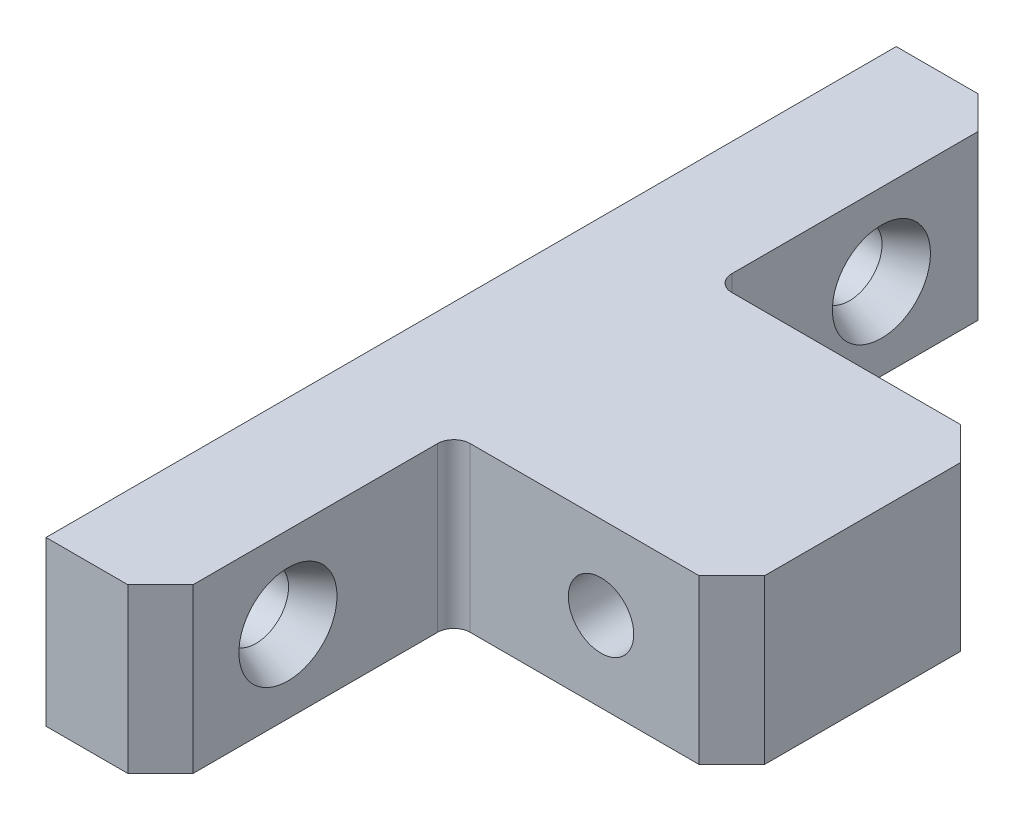
ISO-10303-21;
HEADER;
FILE_DESCRIPTION(('STEP AP214'),'2;1');
FILE_NAME('part.step','',(''),(''),'','','');
FILE_SCHEMA(('AUTOMOTIVE_DESIGN { 1 0 10303 214 1 1 1 1 }'));
ENDSEC;
DATA;
#1=APPLICATION_CONTEXT('core data for automotive mechanical design processes');
#2=APPLICATION_PROTOCOL_DEFINITION('international standard','automotive_design',2000,#1);
#3=PRODUCT_CONTEXT('',#1,'mechanical');
#4=PRODUCT('Part','Part','',(#3));
#5=PRODUCT_RELATED_PRODUCT_CATEGORY('part','',(#4));
#6=PRODUCT_DEFINITION_FORMATION('','',#4);
#7=PRODUCT_DEFINITION_CONTEXT('part definition',#1,'design');
#8=PRODUCT_DEFINITION('design','',#6,#7);
#9=PRODUCT_DEFINITION_SHAPE('','',#8);
#10=(LENGTH_UNIT() NAMED_UNIT(*) SI_UNIT(.MILLI.,.METRE.));
#11=(NAMED_UNIT(*) PLANE_ANGLE_UNIT() SI_UNIT($,.RADIAN.));
#12=(NAMED_UNIT(*) SI_UNIT($,.STERADIAN.) SOLID_ANGLE_UNIT());
#13=UNCERTAINTY_MEASURE_WITH_UNIT(LENGTH_MEASURE(1.E-05),#10,'distance_accuracy_value','');
#14=(GEOMETRIC_REPRESENTATION_CONTEXT(3) GLOBAL_UNCERTAINTY_ASSIGNED_CONTEXT((#13)) GLOBAL_UNIT_ASSIGNED_CONTEXT((#10,
#11,#12)) REPRESENTATION_CONTEXT('',''));
#15=CARTESIAN_POINT('',(0.,0.,0.));
#16=DIRECTION('',(0.,0.,1.));
#17=DIRECTION('',(1.,0.,0.));
#18=AXIS2_PLACEMENT_3D('',#15,#16,#17);
#19=CARTESIAN_POINT('',(24.,5.10377483143912,26.));
#20=DIRECTION('',(0.,0.,-1.));
#21=DIRECTION('',(-1.,0.,0.));
#22=AXIS2_PLACEMENT_3D('',#19,#20,#21);
#23=PLANE('',#22);
#24=DIRECTION('',(-1.,0.,0.));
#25=VECTOR('',#24,1.);
#26=CARTESIAN_POINT('',(24.,-4.89622516856088,26.));
#27=LINE('',#26,#25);
#28=CARTESIAN_POINT('',(4.99999999999999,-4.89622516856088,26.));
#29=VERTEX_POINT('',#28);
#30=CARTESIAN_POINT('',(0.,-4.89622516856088,26.));
#31=VERTEX_POINT('',#30);
#32=EDGE_CURVE('E134',#29,#31,#27,.T.);
#33=ORIENTED_EDGE('',*,*,#32,.F.);
#34=DIRECTION('',(0.,1.,0.));
#35=VECTOR('',#34,1.);
#36=CARTESIAN_POINT('',(5.,5.10377483143912,26.));
#37=LINE('',#36,#35);
#38=CARTESIAN_POINT('',(4.99999999999999,5.10377483143912,26.));
#39=VERTEX_POINT('',#38);
#40=EDGE_CURVE('E40',#29,#39,#37,.T.);
#41=ORIENTED_EDGE('',*,*,#40,.T.);
#42=DIRECTION('',(-1.,0.,0.));
#43=VECTOR('',#42,1.);
#44=CARTESIAN_POINT('',(24.,5.10377483143912,26.));
#45=LINE('',#44,#43);
#46=CARTESIAN_POINT('',(0.,5.10377483143912,26.));
#47=VERTEX_POINT('',#46);
#48=EDGE_CURVE('E159',#39,#47,#45,.T.);
#49=ORIENTED_EDGE('',*,*,#48,.T.);
#50=DIRECTION('',(0.,-1.,0.));
#51=VECTOR('',#50,1.);
#52=CARTESIAN_POINT('',(0.,5.10377483143912,26.));
#53=LINE('',#52,#51);
#54=EDGE_CURVE('E155',#47,#31,#53,.T.);
#55=ORIENTED_EDGE('',*,*,#54,.T.);
#56=EDGE_LOOP('',(#33,#41,#49,#55));
#57=FACE_BOUND('',#56,.T.);
#58=ADVANCED_FACE('F31',(#57),#23,.F.);
#59=CARTESIAN_POINT('',(24.,-4.89622516856088,26.));
#60=DIRECTION('',(0.,1.,0.));
#61=DIRECTION('',(0.,0.,1.));
#62=AXIS2_PLACEMENT_3D('',#59,#60,#61);
#63=PLANE('',#62);
#64=DIRECTION('',(1.,0.,0.));
#65=VECTOR('',#64,1.);
#66=CARTESIAN_POINT('',(24.,-4.89622516856088,-7.944854776541));
#67=LINE('',#66,#65);
#68=CARTESIAN_POINT('',(8.,-4.89622516856088,-7.944854776541));
#69=VERTEX_POINT('',#68);
#70=CARTESIAN_POINT('',(22.,-4.89622516856088,-7.944854776541));
#71=VERTEX_POINT('',#70);
#72=EDGE_CURVE('E256',#69,#71,#67,.T.);
#73=ORIENTED_EDGE('',*,*,#72,.T.);
#74=DIRECTION('',(0.707106781186546,0.,0.707106781186549));
#75=VECTOR('',#74,1.);
#76=CARTESIAN_POINT('',(22.,-4.89622516856088,-7.944854776541));
#77=LINE('',#76,#75);
#78=CARTESIAN_POINT('',(24.,-4.89622516856088,-5.94485477654098));
#79=VERTEX_POINT('',#78);
#80=EDGE_CURVE('E209',#71,#79,#77,.T.);
#81=ORIENTED_EDGE('',*,*,#80,.T.);
#82=DIRECTION('',(0.,0.,-1.));
#83=VECTOR('',#82,1.);
#84=CARTESIAN_POINT('',(24.,-4.89622516856088,26.));
#85=LINE('',#84,#83);
#86=CARTESIAN_POINT('',(24.,-4.89622516856088,6.055145223459));
#87=VERTEX_POINT('',#86);
#88=EDGE_CURVE('E172',#87,#79,#85,.T.);
#89=ORIENTED_EDGE('',*,*,#88,.F.);
#90=DIRECTION('',(-0.707106781186547,0.,0.707106781186549));
#91=VECTOR('',#90,1.);
#92=CARTESIAN_POINT('',(22.,-4.89622516856088,8.055145223459));
#93=LINE('',#92,#91);
#94=CARTESIAN_POINT('',(22.,-4.89622516856088,8.055145223459));
#95=VERTEX_POINT('',#94);
#96=EDGE_CURVE('E207',#87,#95,#93,.T.);
#97=ORIENTED_EDGE('',*,*,#96,.T.);
#98=DIRECTION('',(-1.,0.,0.));
#99=VECTOR('',#98,1.);
#100=CARTESIAN_POINT('',(24.,-4.89622516856088,8.055145223459));
#101=LINE('',#100,#99);
#102=CARTESIAN_POINT('',(8.,-4.89622516856088,8.055145223459));
#103=VERTEX_POINT('',#102);
#104=EDGE_CURVE('E163',#95,#103,#101,.T.);
#105=ORIENTED_EDGE('',*,*,#104,.T.);
#106=CARTESIAN_POINT('',(8.,-4.89622516856088,9.055145223459));
#107=DIRECTION('',(0.,1.,0.));
#108=DIRECTION('',(0.,0.,1.));
#109=AXIS2_PLACEMENT_3D('',#106,#107,#108);
#110=CIRCLE('',#109,1.);
#111=CARTESIAN_POINT('',(7.,-4.89622516856088,9.055145223459));
#112=VERTEX_POINT('',#111);
#113=EDGE_CURVE('E199',#103,#112,#110,.T.);
#114=ORIENTED_EDGE('',*,*,#113,.T.);
#115=DIRECTION('',(0.,0.,1.));
#116=VECTOR('',#115,1.);
#117=CARTESIAN_POINT('',(7.,-4.89622516856088,26.));
#118=LINE('',#117,#116);
#119=CARTESIAN_POINT('',(7.,-4.89622516856088,24.));
#120=VERTEX_POINT('',#119);
#121=EDGE_CURVE('E161',#112,#120,#118,.T.);
#122=ORIENTED_EDGE('',*,*,#121,.T.);
#123=DIRECTION('',(0.707106781186548,0.,-0.707106781186547));
#124=VECTOR('',#123,1.);
#125=CARTESIAN_POINT('',(5.,-4.89622516856088,26.));
#126=LINE('',#125,#124);
#127=EDGE_CURVE('E143',#120,#29,#126,.F.);
#128=ORIENTED_EDGE('',*,*,#127,.T.);
#129=ORIENTED_EDGE('',*,*,#32,.T.);
#130=DIRECTION('',(0.,0.,-1.));
#131=VECTOR('',#130,1.);
#132=CARTESIAN_POINT('',(0.,-4.89622516856088,26.));
#133=LINE('',#132,#131);
#134=CARTESIAN_POINT('',(0.,-4.89622516856088,-26.));
#135=VERTEX_POINT('',#134);
#136=EDGE_CURVE('E139',#31,#135,#133,.T.);
#137=ORIENTED_EDGE('',*,*,#136,.T.);
#138=DIRECTION('',(-1.,0.,0.));
#139=VECTOR('',#138,1.);
#140=CARTESIAN_POINT('',(24.,-4.89622516856088,-26.));
#141=LINE('',#140,#139);
#142=CARTESIAN_POINT('',(5.,-4.89622516856088,-26.));
#143=VERTEX_POINT('',#142);
#144=EDGE_CURVE('E149',#143,#135,#141,.T.);
#145=ORIENTED_EDGE('',*,*,#144,.F.);
#146=DIRECTION('',(-0.707106781186548,0.,-0.707106781186548));
#147=VECTOR('',#146,1.);
#148=CARTESIAN_POINT('',(5.,-4.89622516856088,-26.));
#149=LINE('',#148,#147);
#150=CARTESIAN_POINT('',(7.,-4.89622516856088,-24.));
#151=VERTEX_POINT('',#150);
#152=EDGE_CURVE('E205',#143,#151,#149,.F.);
#153=ORIENTED_EDGE('',*,*,#152,.T.);
#154=DIRECTION('',(0.,0.,1.));
#155=VECTOR('',#154,1.);
#156=CARTESIAN_POINT('',(7.,-4.89622516856088,26.));
#157=LINE('',#156,#155);
#158=CARTESIAN_POINT('',(7.,-4.89622516856088,-8.944854776541));
#159=VERTEX_POINT('',#158);
#160=EDGE_CURVE('E258',#151,#159,#157,.T.);
#161=ORIENTED_EDGE('',*,*,#160,.T.);
#162=CARTESIAN_POINT('',(8.,-4.89622516856088,-8.944854776541));
#163=DIRECTION('',(0.,1.,0.));
#164=DIRECTION('',(0.,0.,1.));
#165=AXIS2_PLACEMENT_3D('',#162,#163,#164);
#166=CIRCLE('',#165,1.);
#167=EDGE_CURVE('E193',#159,#69,#166,.T.);
#168=ORIENTED_EDGE('',*,*,#167,.T.);
#169=EDGE_LOOP('',(#73,#81,#89,#97,#105,#114,#122,#128,#129,#137,#145,#153,#161,#168));
#170=FACE_BOUND('',#169,.T.);
#171=ADVANCED_FACE('F137',(#170),#63,.F.);
#172=CARTESIAN_POINT('',(24.,5.10377483143912,-26.));
#173=DIRECTION('',(0.,0.,1.));
#174=DIRECTION('',(1.,0.,0.));
#175=AXIS2_PLACEMENT_3D('',#172,#173,#174);
#176=PLANE('',#175);
#177=DIRECTION('',(-1.,0.,0.));
#178=VECTOR('',#177,1.);
#179=CARTESIAN_POINT('',(24.,5.10377483143912,-26.));
#180=LINE('',#179,#178);
#181=CARTESIAN_POINT('',(5.,5.10377483143912,-26.));
#182=VERTEX_POINT('',#181);
#183=CARTESIAN_POINT('',(0.,5.10377483143912,-26.));
#184=VERTEX_POINT('',#183);
#185=EDGE_CURVE('E174',#182,#184,#180,.T.);
#186=ORIENTED_EDGE('',*,*,#185,.F.);
#187=DIRECTION('',(0.,-1.,0.));
#188=VECTOR('',#187,1.);
#189=CARTESIAN_POINT('',(5.,5.10377483143912,-26.));
#190=LINE('',#189,#188);
#191=EDGE_CURVE('E223',#182,#143,#190,.T.);
#192=ORIENTED_EDGE('',*,*,#191,.T.);
#193=ORIENTED_EDGE('',*,*,#144,.T.);
#194=DIRECTION('',(0.,1.,0.));
#195=VECTOR('',#194,1.);
#196=CARTESIAN_POINT('',(0.,5.10377483143912,-26.));
#197=LINE('',#196,#195);
#198=EDGE_CURVE('E157',#135,#184,#197,.T.);
#199=ORIENTED_EDGE('',*,*,#198,.T.);
#200=EDGE_LOOP('',(#186,#192,#193,#199));
#201=FACE_BOUND('',#200,.T.);
#202=ADVANCED_FACE('F293',(#201),#176,.F.);
#203=CARTESIAN_POINT('',(24.,5.10377483143912,26.));
#204=DIRECTION('',(0.,-1.,0.));
#205=DIRECTION('',(0.,0.,-1.));
#206=AXIS2_PLACEMENT_3D('',#203,#204,#205);
#207=PLANE('',#206);
#208=DIRECTION('',(0.,0.,1.));
#209=VECTOR('',#208,1.);
#210=CARTESIAN_POINT('',(24.,5.10377483143912,26.));
#211=LINE('',#210,#209);
#212=CARTESIAN_POINT('',(24.,5.10377483143912,-5.94485477654099));
#213=VERTEX_POINT('',#212);
#214=CARTESIAN_POINT('',(24.,5.10377483143912,6.05514522345901));
#215=VERTEX_POINT('',#214);
#216=EDGE_CURVE('E166',#213,#215,#211,.T.);
#217=ORIENTED_EDGE('',*,*,#216,.F.);
#218=DIRECTION('',(-0.707106781186546,0.,-0.707106781186549));
#219=VECTOR('',#218,1.);
#220=CARTESIAN_POINT('',(22.,5.10377483143912,-7.944854776541));
#221=LINE('',#220,#219);
#222=CARTESIAN_POINT('',(22.,5.10377483143912,-7.944854776541));
#223=VERTEX_POINT('',#222);
#224=EDGE_CURVE('E219',#213,#223,#221,.T.);
#225=ORIENTED_EDGE('',*,*,#224,.T.);
#226=DIRECTION('',(-1.,0.,0.));
#227=VECTOR('',#226,1.);
#228=CARTESIAN_POINT('',(24.,5.10377483143912,-7.944854776541));
#229=LINE('',#228,#227);
#230=CARTESIAN_POINT('',(8.,5.10377483143912,-7.944854776541));
#231=VERTEX_POINT('',#230);
#232=EDGE_CURVE('E254',#223,#231,#229,.T.);
#233=ORIENTED_EDGE('',*,*,#232,.T.);
#234=CARTESIAN_POINT('',(8.,5.10377483143912,-8.944854776541));
#235=DIRECTION('',(0.,-1.,0.));
#236=DIRECTION('',(0.,0.,-1.));
#237=AXIS2_PLACEMENT_3D('',#234,#235,#236);
#238=CIRCLE('',#237,1.);
#239=CARTESIAN_POINT('',(7.,5.10377483143912,-8.944854776541));
#240=VERTEX_POINT('',#239);
#241=EDGE_CURVE('E195',#231,#240,#238,.T.);
#242=ORIENTED_EDGE('',*,*,#241,.T.);
#243=DIRECTION('',(0.,0.,-1.));
#244=VECTOR('',#243,1.);
#245=CARTESIAN_POINT('',(7.,5.10377483143912,26.));
#246=LINE('',#245,#244);
#247=CARTESIAN_POINT('',(7.,5.10377483143912,-24.));
#248=VERTEX_POINT('',#247);
#249=EDGE_CURVE('E178',#240,#248,#246,.T.);
#250=ORIENTED_EDGE('',*,*,#249,.T.);
#251=DIRECTION('',(0.707106781186548,0.,0.707106781186548));
#252=VECTOR('',#251,1.);
#253=CARTESIAN_POINT('',(5.,5.10377483143912,-26.));
#254=LINE('',#253,#252);
#255=EDGE_CURVE('E216',#248,#182,#254,.F.);
#256=ORIENTED_EDGE('',*,*,#255,.T.);
#257=ORIENTED_EDGE('',*,*,#185,.T.);
#258=DIRECTION('',(0.,0.,1.));
#259=VECTOR('',#258,1.);
#260=CARTESIAN_POINT('',(0.,5.10377483143912,26.));
#261=LINE('',#260,#259);
#262=EDGE_CURVE('E170',#184,#47,#261,.T.);
#263=ORIENTED_EDGE('',*,*,#262,.T.);
#264=ORIENTED_EDGE('',*,*,#48,.F.);
#265=DIRECTION('',(-0.707106781186548,0.,0.707106781186547));
#266=VECTOR('',#265,1.);
#267=CARTESIAN_POINT('',(5.,5.10377483143912,26.));
#268=LINE('',#267,#266);
#269=CARTESIAN_POINT('',(7.,5.10377483143912,24.));
#270=VERTEX_POINT('',#269);
#271=EDGE_CURVE('E56',#39,#270,#268,.F.);
#272=ORIENTED_EDGE('',*,*,#271,.T.);
#273=DIRECTION('',(0.,0.,-1.));
#274=VECTOR('',#273,1.);
#275=CARTESIAN_POINT('',(7.,5.10377483143912,26.));
#276=LINE('',#275,#274);
#277=CARTESIAN_POINT('',(7.,5.10377483143912,9.055145223459));
#278=VERTEX_POINT('',#277);
#279=EDGE_CURVE('E148',#270,#278,#276,.T.);
#280=ORIENTED_EDGE('',*,*,#279,.T.);
#281=CARTESIAN_POINT('',(8.,5.10377483143912,9.055145223459));
#282=DIRECTION('',(0.,-1.,0.));
#283=DIRECTION('',(0.,0.,-1.));
#284=AXIS2_PLACEMENT_3D('',#281,#282,#283);
#285=CIRCLE('',#284,1.);
#286=CARTESIAN_POINT('',(8.,5.10377483143912,8.055145223459));
#287=VERTEX_POINT('',#286);
#288=EDGE_CURVE('E197',#278,#287,#285,.T.);
#289=ORIENTED_EDGE('',*,*,#288,.T.);
#290=DIRECTION('',(1.,0.,0.));
#291=VECTOR('',#290,1.);
#292=CARTESIAN_POINT('',(24.,5.10377483143912,8.055145223459));
#293=LINE('',#292,#291);
#294=CARTESIAN_POINT('',(22.,5.10377483143912,8.055145223459));
#295=VERTEX_POINT('',#294);
#296=EDGE_CURVE('E260',#287,#295,#293,.T.);
#297=ORIENTED_EDGE('',*,*,#296,.T.);
#298=DIRECTION('',(0.707106781186547,0.,-0.707106781186549));
#299=VECTOR('',#298,1.);
#300=CARTESIAN_POINT('',(22.,5.10377483143912,8.055145223459));
#301=LINE('',#300,#299);
#302=EDGE_CURVE('E48',#295,#215,#301,.T.);
#303=ORIENTED_EDGE('',*,*,#302,.T.);
#304=EDGE_LOOP('',(#217,#225,#233,#242,#250,#256,#257,#263,#264,#272,#280,#289,#297,#303));
#305=FACE_BOUND('',#304,.T.);
#306=ADVANCED_FACE('F288',(#305),#207,.F.);
#307=CARTESIAN_POINT('',(24.,-4.89622516856088,26.));
#308=DIRECTION('',(1.,0.,0.));
#309=DIRECTION('',(0.,0.,-1.));
#310=AXIS2_PLACEMENT_3D('',#307,#308,#309);
#311=PLANE('',#310);
#312=ORIENTED_EDGE('',*,*,#88,.T.);
#313=DIRECTION('',(0.,1.,0.));
#314=VECTOR('',#313,1.);
#315=CARTESIAN_POINT('',(24.,5.10377483143912,-5.944854776541));
#316=LINE('',#315,#314);
#317=EDGE_CURVE('E213',#79,#213,#316,.T.);
#318=ORIENTED_EDGE('',*,*,#317,.T.);
#319=ORIENTED_EDGE('',*,*,#216,.T.);
#320=DIRECTION('',(0.,-1.,0.));
#321=VECTOR('',#320,1.);
#322=CARTESIAN_POINT('',(24.,-4.89622516856088,6.055145223459));
#323=LINE('',#322,#321);
#324=EDGE_CURVE('E211',#215,#87,#323,.T.);
#325=ORIENTED_EDGE('',*,*,#324,.T.);
#326=EDGE_LOOP('',(#312,#318,#319,#325));
#327=FACE_BOUND('',#326,.T.);
#328=ADVANCED_FACE('F269',(#327),#311,.T.);
#329=CARTESIAN_POINT('',(0.,-4.89622516856088,26.));
#330=DIRECTION('',(1.,0.,0.));
#331=DIRECTION('',(0.,0.,-1.));
#332=AXIS2_PLACEMENT_3D('',#329,#330,#331);
#333=PLANE('',#332);
#334=CARTESIAN_POINT('',(0.,0.,0.));
#335=DIRECTION('',(-1.,0.,0.));
#336=DIRECTION('',(0.,0.,1.));
#337=AXIS2_PLACEMENT_3D('',#334,#335,#336);
#338=CIRCLE('',#337,2.);
#339=CARTESIAN_POINT('',(0.,0.,2.));
#340=VERTEX_POINT('',#339);
#341=EDGE_CURVE('E519',#340,#340,#338,.T.);
#342=ORIENTED_EDGE('',*,*,#341,.F.);
#343=EDGE_LOOP('',(#342));
#344=FACE_BOUND('',#343,.T.);
#345=CARTESIAN_POINT('',(0.,0.103774831441823,-18.0924060769296));
#346=DIRECTION('',(1.,0.,0.));
#347=DIRECTION('',(0.,0.,1.));
#348=AXIS2_PLACEMENT_3D('',#345,#346,#347);
#349=CIRCLE('',#348,1.99999999999807);
#350=CARTESIAN_POINT('',(0.,0.103774831441823,-20.0924060769276));
#351=VERTEX_POINT('',#350);
#352=EDGE_CURVE('E231',#351,#351,#349,.T.);
#353=ORIENTED_EDGE('',*,*,#352,.T.);
#354=EDGE_LOOP('',(#353));
#355=FACE_BOUND('',#354,.T.);
#356=CARTESIAN_POINT('',(0.,0.103774831441823,18.2026965238476));
#357=DIRECTION('',(1.,0.,0.));
#358=DIRECTION('',(0.,0.,-1.));
#359=AXIS2_PLACEMENT_3D('',#356,#357,#358);
#360=CIRCLE('',#359,2.00000000000193);
#361=CARTESIAN_POINT('',(0.,0.103774831441823,16.2026965238456));
#362=VERTEX_POINT('',#361);
#363=EDGE_CURVE('E251',#362,#362,#360,.T.);
#364=ORIENTED_EDGE('',*,*,#363,.T.);
#365=EDGE_LOOP('',(#364));
#366=FACE_BOUND('',#365,.T.);
#367=ORIENTED_EDGE('',*,*,#54,.F.);
#368=ORIENTED_EDGE('',*,*,#262,.F.);
#369=ORIENTED_EDGE('',*,*,#198,.F.);
#370=ORIENTED_EDGE('',*,*,#136,.F.);
#371=EDGE_LOOP('',(#367,#368,#369,#370));
#372=FACE_BOUND('',#371,.T.);
#373=ADVANCED_FACE('F153',(#344,#355,#366,#372),#333,.F.);
#374=CARTESIAN_POINT('',(7.,-8.5217248299876,8.055145223459));
#375=DIRECTION('',(-1.,0.,0.));
#376=DIRECTION('',(0.,0.,1.));
#377=AXIS2_PLACEMENT_3D('',#374,#375,#376);
#378=PLANE('',#377);
#379=CARTESIAN_POINT('',(7.,0.103774831441823,18.2026965238476));
#380=DIRECTION('',(1.,0.,0.));
#381=DIRECTION('',(0.,0.,-1.));
#382=AXIS2_PLACEMENT_3D('',#379,#380,#381);
#383=CIRCLE('',#382,3.);
#384=CARTESIAN_POINT('',(7.,0.103774831441823,15.2026965238476));
#385=VERTEX_POINT('',#384);
#386=EDGE_CURVE('E235',#385,#385,#383,.T.);
#387=ORIENTED_EDGE('',*,*,#386,.F.);
#388=EDGE_LOOP('',(#387));
#389=FACE_BOUND('',#388,.T.);
#390=ORIENTED_EDGE('',*,*,#279,.F.);
#391=DIRECTION('',(0.,-1.,0.));
#392=VECTOR('',#391,1.);
#393=CARTESIAN_POINT('',(7.,-8.5217248299876,24.));
#394=LINE('',#393,#392);
#395=EDGE_CURVE('E11',#270,#120,#394,.T.);
#396=ORIENTED_EDGE('',*,*,#395,.T.);
#397=ORIENTED_EDGE('',*,*,#121,.F.);
#398=DIRECTION('',(0.,1.,0.));
#399=VECTOR('',#398,1.);
#400=CARTESIAN_POINT('',(7.,5.10377483143912,9.055145223459));
#401=LINE('',#400,#399);
#402=EDGE_CURVE('E187',#112,#278,#401,.T.);
#403=ORIENTED_EDGE('',*,*,#402,.T.);
#404=EDGE_LOOP('',(#390,#396,#397,#403));
#405=FACE_BOUND('',#404,.T.);
#406=ADVANCED_FACE('F285',(#389,#405),#378,.F.);
#407=CARTESIAN_POINT('',(7.,5.76425818629033,8.055145223459));
#408=DIRECTION('',(0.,0.,-1.));
#409=DIRECTION('',(0.,1.,0.));
#410=AXIS2_PLACEMENT_3D('',#407,#408,#409);
#411=PLANE('',#410);
#412=CARTESIAN_POINT('',(16.,0.,8.055145223459));
#413=DIRECTION('',(0.,0.,1.));
#414=DIRECTION('',(1.,0.,0.));
#415=AXIS2_PLACEMENT_3D('',#412,#413,#414);
#416=CIRCLE('',#415,2.);
#417=CARTESIAN_POINT('',(18.,0.,8.05514522345899));
#418=VERTEX_POINT('',#417);
#419=EDGE_CURVE('E232',#418,#418,#416,.T.);
#420=ORIENTED_EDGE('',*,*,#419,.F.);
#421=EDGE_LOOP('',(#420));
#422=FACE_BOUND('',#421,.T.);
#423=ORIENTED_EDGE('',*,*,#104,.F.);
#424=DIRECTION('',(0.,1.,0.));
#425=VECTOR('',#424,1.);
#426=CARTESIAN_POINT('',(22.,5.10377483143912,8.055145223459));
#427=LINE('',#426,#425);
#428=EDGE_CURVE('E221',#95,#295,#427,.T.);
#429=ORIENTED_EDGE('',*,*,#428,.T.);
#430=ORIENTED_EDGE('',*,*,#296,.F.);
#431=DIRECTION('',(0.,1.,0.));
#432=VECTOR('',#431,1.);
#433=CARTESIAN_POINT('',(8.,-4.89622516856088,8.055145223459));
#434=LINE('',#433,#432);
#435=EDGE_CURVE('E190',#287,#103,#434,.F.);
#436=ORIENTED_EDGE('',*,*,#435,.T.);
#437=EDGE_LOOP('',(#423,#429,#430,#436));
#438=FACE_BOUND('',#437,.T.);
#439=ADVANCED_FACE('F275',(#422,#438),#411,.F.);
#440=CARTESIAN_POINT('',(7.,5.76425818629032,-31.5153591792094));
#441=DIRECTION('',(-1.,0.,0.));
#442=DIRECTION('',(0.,0.,1.));
#443=AXIS2_PLACEMENT_3D('',#440,#441,#442);
#444=PLANE('',#443);
#445=CARTESIAN_POINT('',(7.,0.103774831441823,-18.0924060769296));
#446=DIRECTION('',(1.,0.,0.));
#447=DIRECTION('',(0.,0.,-1.));
#448=AXIS2_PLACEMENT_3D('',#445,#446,#447);
#449=CIRCLE('',#448,3.);
#450=CARTESIAN_POINT('',(7.,0.103774831441823,-21.0924060769296));
#451=VERTEX_POINT('',#450);
#452=EDGE_CURVE('E245',#451,#451,#449,.T.);
#453=ORIENTED_EDGE('',*,*,#452,.F.);
#454=EDGE_LOOP('',(#453));
#455=FACE_BOUND('',#454,.T.);
#456=ORIENTED_EDGE('',*,*,#160,.F.);
#457=DIRECTION('',(0.,1.,0.));
#458=VECTOR('',#457,1.);
#459=CARTESIAN_POINT('',(7.,5.76425818629032,-24.));
#460=LINE('',#459,#458);
#461=EDGE_CURVE('E226',#151,#248,#460,.T.);
#462=ORIENTED_EDGE('',*,*,#461,.T.);
#463=ORIENTED_EDGE('',*,*,#249,.F.);
#464=DIRECTION('',(0.,-1.,0.));
#465=VECTOR('',#464,1.);
#466=CARTESIAN_POINT('',(7.,-4.89622516856088,-8.944854776541));
#467=LINE('',#466,#465);
#468=EDGE_CURVE('E181',#240,#159,#467,.T.);
#469=ORIENTED_EDGE('',*,*,#468,.T.);
#470=EDGE_LOOP('',(#456,#462,#463,#469));
#471=FACE_BOUND('',#470,.T.);
#472=ADVANCED_FACE('F299',(#455,#471),#444,.F.);
#473=CARTESIAN_POINT('',(7.,5.76425818629033,-7.944854776541));
#474=DIRECTION('',(0.,0.,1.));
#475=DIRECTION('',(0.,-1.,0.));
#476=AXIS2_PLACEMENT_3D('',#473,#474,#475);
#477=PLANE('',#476);
#478=CARTESIAN_POINT('',(16.,0.,-7.944854776541));
#479=DIRECTION('',(0.,0.,1.));
#480=DIRECTION('',(0.,-1.,0.));
#481=AXIS2_PLACEMENT_3D('',#478,#479,#480);
#482=CIRCLE('',#481,2.);
#483=CARTESIAN_POINT('',(18.,0.,-7.944854776541));
#484=VERTEX_POINT('',#483);
#485=EDGE_CURVE('E229',#484,#484,#482,.T.);
#486=ORIENTED_EDGE('',*,*,#485,.T.);
#487=EDGE_LOOP('',(#486));
#488=FACE_BOUND('',#487,.T.);
#489=ORIENTED_EDGE('',*,*,#232,.F.);
#490=DIRECTION('',(0.,-1.,0.));
#491=VECTOR('',#490,1.);
#492=CARTESIAN_POINT('',(22.,-4.89622516856088,-7.944854776541));
#493=LINE('',#492,#491);
#494=EDGE_CURVE('E201',#223,#71,#493,.T.);
#495=ORIENTED_EDGE('',*,*,#494,.T.);
#496=ORIENTED_EDGE('',*,*,#72,.F.);
#497=DIRECTION('',(0.,-1.,0.));
#498=VECTOR('',#497,1.);
#499=CARTESIAN_POINT('',(8.,5.10377483143912,-7.944854776541));
#500=LINE('',#499,#498);
#501=EDGE_CURVE('E184',#69,#231,#500,.F.);
#502=ORIENTED_EDGE('',*,*,#501,.T.);
#503=EDGE_LOOP('',(#489,#495,#496,#502));
#504=FACE_BOUND('',#503,.T.);
#505=ADVANCED_FACE('F322',(#488,#504),#477,.F.);
#506=CARTESIAN_POINT('',(8.,5.76425818629033,-8.944854776541));
#507=DIRECTION('',(0.,1.,0.));
#508=DIRECTION('',(0.,0.,1.));
#509=AXIS2_PLACEMENT_3D('',#506,#507,#508);
#510=CYLINDRICAL_SURFACE('',#509,1.);
#511=ORIENTED_EDGE('',*,*,#241,.F.);
#512=ORIENTED_EDGE('',*,*,#501,.F.);
#513=ORIENTED_EDGE('',*,*,#167,.F.);
#514=ORIENTED_EDGE('',*,*,#468,.F.);
#515=EDGE_LOOP('',(#511,#512,#513,#514));
#516=FACE_BOUND('',#515,.T.);
#517=ADVANCED_FACE('F319',(#516),#510,.F.);
#518=CARTESIAN_POINT('',(8.,-8.5217248299876,9.055145223459));
#519=DIRECTION('',(0.,-1.,0.));
#520=DIRECTION('',(0.,0.,-1.));
#521=AXIS2_PLACEMENT_3D('',#518,#519,#520);
#522=CYLINDRICAL_SURFACE('',#521,1.);
#523=ORIENTED_EDGE('',*,*,#113,.F.);
#524=ORIENTED_EDGE('',*,*,#435,.F.);
#525=ORIENTED_EDGE('',*,*,#288,.F.);
#526=ORIENTED_EDGE('',*,*,#402,.F.);
#527=EDGE_LOOP('',(#523,#524,#525,#526));
#528=FACE_BOUND('',#527,.T.);
#529=ADVANCED_FACE('F282',(#528),#522,.F.);
#530=CARTESIAN_POINT('',(22.,5.76425818629033,-7.944854776541));
#531=DIRECTION('',(0.707106781186549,0.,-0.707106781186546));
#532=DIRECTION('',(-0.707106781186546,0.,-0.707106781186549));
#533=AXIS2_PLACEMENT_3D('',#530,#531,#532);
#534=PLANE('',#533);
#535=ORIENTED_EDGE('',*,*,#224,.F.);
#536=ORIENTED_EDGE('',*,*,#317,.F.);
#537=ORIENTED_EDGE('',*,*,#80,.F.);
#538=ORIENTED_EDGE('',*,*,#494,.F.);
#539=EDGE_LOOP('',(#535,#536,#537,#538));
#540=FACE_BOUND('',#539,.T.);
#541=ADVANCED_FACE('F309',(#540),#534,.T.);
#542=CARTESIAN_POINT('',(22.,5.76425818629033,8.055145223459));
#543=DIRECTION('',(0.707106781186549,0.,0.707106781186547));
#544=DIRECTION('',(0.707106781186547,0.,-0.707106781186549));
#545=AXIS2_PLACEMENT_3D('',#542,#543,#544);
#546=PLANE('',#545);
#547=ORIENTED_EDGE('',*,*,#96,.F.);
#548=ORIENTED_EDGE('',*,*,#324,.F.);
#549=ORIENTED_EDGE('',*,*,#302,.F.);
#550=ORIENTED_EDGE('',*,*,#428,.F.);
#551=EDGE_LOOP('',(#547,#548,#549,#550));
#552=FACE_BOUND('',#551,.T.);
#553=ADVANCED_FACE('F272',(#552),#546,.T.);
#554=CARTESIAN_POINT('',(5.,5.10377483143912,-26.));
#555=DIRECTION('',(-0.707106781186547,0.,0.707106781186547));
#556=DIRECTION('',(0.707106781186548,0.,0.707106781186548));
#557=AXIS2_PLACEMENT_3D('',#554,#555,#556);
#558=PLANE('',#557);
#559=ORIENTED_EDGE('',*,*,#255,.F.);
#560=ORIENTED_EDGE('',*,*,#461,.F.);
#561=ORIENTED_EDGE('',*,*,#152,.F.);
#562=ORIENTED_EDGE('',*,*,#191,.F.);
#563=EDGE_LOOP('',(#559,#560,#561,#562));
#564=FACE_BOUND('',#563,.T.);
#565=ADVANCED_FACE('F302',(#564),#558,.F.);
#566=CARTESIAN_POINT('',(5.,5.10377483143912,26.));
#567=DIRECTION('',(-0.707106781186547,0.,-0.707106781186548));
#568=DIRECTION('',(-0.707106781186548,0.,0.707106781186547));
#569=AXIS2_PLACEMENT_3D('',#566,#567,#568);
#570=PLANE('',#569);
#571=ORIENTED_EDGE('',*,*,#127,.F.);
#572=ORIENTED_EDGE('',*,*,#395,.F.);
#573=ORIENTED_EDGE('',*,*,#271,.F.);
#574=ORIENTED_EDGE('',*,*,#40,.F.);
#575=EDGE_LOOP('',(#571,#572,#573,#574));
#576=FACE_BOUND('',#575,.T.);
#577=ADVANCED_FACE('F33',(#576),#570,.F.);
#578=CARTESIAN_POINT('',(0.,0.103774831441823,18.2026965238476));
#579=DIRECTION('',(1.,0.,0.));
#580=DIRECTION('',(0.,0.,-1.));
#581=AXIS2_PLACEMENT_3D('',#578,#579,#580);
#582=CYLINDRICAL_SURFACE('',#581,2.00000000000193);
#583=CARTESIAN_POINT('',(5.03738949449863,0.103774831441823,18.2026965238476));
#584=DIRECTION('',(1.,0.,0.));
#585=DIRECTION('',(0.,0.,-1.));
#586=AXIS2_PLACEMENT_3D('',#583,#584,#585);
#587=CIRCLE('',#586,2.00000000000193);
#588=CARTESIAN_POINT('',(5.03738949449863,0.103774831441823,16.2026965238456));
#589=VERTEX_POINT('',#588);
#590=EDGE_CURVE('E233',#589,#589,#587,.T.);
#591=CARTESIAN_POINT('',(5.03738949449863,0.103774831441823,16.2026965238456));
#592=CARTESIAN_POINT('',(4.98491668726427,0.103774831441823,16.2026965238456));
#593=CARTESIAN_POINT('',(4.93244388002991,0.103774831441823,16.2026965238456));
#594=CARTESIAN_POINT('',(4.82749826556119,0.103774831441823,16.2026965238456));
#595=CARTESIAN_POINT('',(4.77502545832683,0.103774831441823,16.2026965238456));
#596=CARTESIAN_POINT('',(4.67007984385811,0.103774831441823,16.2026965238456));
#597=CARTESIAN_POINT('',(4.61760703662375,0.103774831441823,16.2026965238456));
#598=CARTESIAN_POINT('',(4.51266142215503,0.103774831441823,16.2026965238456));
#599=CARTESIAN_POINT('',(4.46018861492067,0.103774831441823,16.2026965238456));
#600=CARTESIAN_POINT('',(4.35524300045194,0.103774831441823,16.2026965238456));
#601=CARTESIAN_POINT('',(4.30277019321758,0.103774831441823,16.2026965238456));
#602=CARTESIAN_POINT('',(4.19782457874886,0.103774831441823,16.2026965238456));
#603=CARTESIAN_POINT('',(4.1453517715145,0.103774831441823,16.2026965238456));
#604=CARTESIAN_POINT('',(4.04040615704578,0.103774831441823,16.2026965238456));
#605=CARTESIAN_POINT('',(3.98793334981142,0.103774831441823,16.2026965238456));
#606=CARTESIAN_POINT('',(3.8829877353427,0.103774831441823,16.2026965238456));
#607=CARTESIAN_POINT('',(3.83051492810834,0.103774831441823,16.2026965238456));
#608=CARTESIAN_POINT('',(3.72556931363961,0.103774831441823,16.2026965238456));
#609=CARTESIAN_POINT('',(3.67309650640525,0.103774831441823,16.2026965238456));
#610=CARTESIAN_POINT('',(3.56815089193653,0.103774831441823,16.2026965238456));
#611=CARTESIAN_POINT('',(3.51567808470217,0.103774831441823,16.2026965238456));
#612=CARTESIAN_POINT('',(3.41073247023345,0.103774831441823,16.2026965238456));
#613=CARTESIAN_POINT('',(3.35825966299909,0.103774831441823,16.2026965238456));
#614=CARTESIAN_POINT('',(3.25331404853037,0.103774831441823,16.2026965238456));
#615=CARTESIAN_POINT('',(3.20084124129601,0.103774831441823,16.2026965238456));
#616=CARTESIAN_POINT('',(3.09589562682729,0.103774831441823,16.2026965238456));
#617=CARTESIAN_POINT('',(3.04342281959292,0.103774831441823,16.2026965238456));
#618=CARTESIAN_POINT('',(2.9384772051242,0.103774831441823,16.2026965238456));
#619=CARTESIAN_POINT('',(2.88600439788984,0.103774831441823,16.2026965238456));
#620=CARTESIAN_POINT('',(2.78105878342112,0.103774831441823,16.2026965238456));
#621=CARTESIAN_POINT('',(2.72858597618676,0.103774831441823,16.2026965238456));
#622=CARTESIAN_POINT('',(2.62364036171804,0.103774831441823,16.2026965238456));
#623=CARTESIAN_POINT('',(2.57116755448368,0.103774831441823,16.2026965238456));
#624=CARTESIAN_POINT('',(2.46622194001496,0.103774831441823,16.2026965238456));
#625=CARTESIAN_POINT('',(2.4137491327806,0.103774831441823,16.2026965238456));
#626=CARTESIAN_POINT('',(2.30880351831187,0.103774831441823,16.2026965238456));
#627=CARTESIAN_POINT('',(2.25633071107751,0.103774831441823,16.2026965238456));
#628=CARTESIAN_POINT('',(2.15138509660879,0.103774831441823,16.2026965238456));
#629=CARTESIAN_POINT('',(2.09891228937443,0.103774831441823,16.2026965238456));
#630=CARTESIAN_POINT('',(1.99396667490571,0.103774831441823,16.2026965238456));
#631=CARTESIAN_POINT('',(1.94149386767135,0.103774831441823,16.2026965238456));
#632=CARTESIAN_POINT('',(1.83654825320263,0.103774831441823,16.2026965238456));
#633=CARTESIAN_POINT('',(1.78407544596827,0.103774831441823,16.2026965238456));
#634=CARTESIAN_POINT('',(1.67912983149954,0.103774831441823,16.2026965238456));
#635=CARTESIAN_POINT('',(1.62665702426518,0.103774831441823,16.2026965238456));
#636=CARTESIAN_POINT('',(1.52171140979646,0.103774831441823,16.2026965238456));
#637=CARTESIAN_POINT('',(1.4692386025621,0.103774831441823,16.2026965238456));
#638=CARTESIAN_POINT('',(1.36429298809338,0.103774831441823,16.2026965238456));
#639=CARTESIAN_POINT('',(1.31182018085902,0.103774831441823,16.2026965238456));
#640=CARTESIAN_POINT('',(1.2068745663903,0.103774831441823,16.2026965238456));
#641=CARTESIAN_POINT('',(1.15440175915594,0.103774831441823,16.2026965238456));
#642=CARTESIAN_POINT('',(1.04945614468722,0.103774831441823,16.2026965238456));
#643=CARTESIAN_POINT('',(0.996983337452855,0.103774831441823,16.2026965238456));
#644=CARTESIAN_POINT('',(0.892037722984133,0.103774831441823,16.2026965238456));
#645=CARTESIAN_POINT('',(0.839564915749772,0.103774831441823,16.2026965238456));
#646=CARTESIAN_POINT('',(0.734619301281051,0.103774831441823,16.2026965238456));
#647=CARTESIAN_POINT('',(0.68214649404669,0.103774831441823,16.2026965238456));
#648=CARTESIAN_POINT('',(0.577200879577968,0.103774831441823,16.2026965238456));
#649=CARTESIAN_POINT('',(0.524728072343607,0.103774831441823,16.2026965238456));
#650=CARTESIAN_POINT('',(0.419782457874886,0.103774831441823,16.2026965238456));
#651=CARTESIAN_POINT('',(0.367309650640525,0.103774831441823,16.2026965238456));
#652=CARTESIAN_POINT('',(0.262364036171804,0.103774831441823,16.2026965238456));
#653=CARTESIAN_POINT('',(0.209891228937443,0.103774831441823,16.2026965238456));
#654=CARTESIAN_POINT('',(0.104945614468722,0.103774831441823,16.2026965238456));
#655=CARTESIAN_POINT('',(0.0524728072343609,0.103774831441823,16.2026965238456));
#656=CARTESIAN_POINT('',(0.,0.103774831441823,16.2026965238456));
#657=B_SPLINE_CURVE_WITH_KNOTS('',3,(#591,#592,#593,#594,#595,#596,#597,#598,#599,#600,#601,
#602,#603,#604,#605,#606,#607,#608,#609,#610,#611,#612,#613,#614,#615,#616,#617,#618,#619,#620,
#621,#622,#623,#624,#625,#626,#627,#628,#629,#630,#631,#632,#633,#634,#635,#636,#637,#638,#639,
#640,#641,#642,#643,#644,#645,#646,#647,#648,#649,#650,#651,#652,#653,#654,#655,#656),
.UNSPECIFIED.,.F.,.F.,(4,2,2,2,2,2,2,2,2,2,2,2,2,2,2,2,2,2,2,2,2,2,2,2,2,2,2,2,2,2,2,2,4),(0.,
0.157418421703082,0.314836843406165,0.472255265109247,0.629673686812329,0.787092108515412,
0.944510530218494,1.10192895192158,1.25934737362466,1.41676579532774,1.57418421703082,
1.73160263873391,1.88902106043699,2.04643948214007,2.20385790384315,2.36127632554623,
2.51869474724932,2.6761131689524,2.83353159065548,2.99095001235856,3.14836843406165,
3.30578685576473,3.46320527746781,3.62062369917089,3.77804212087397,3.93546054257706,
4.09287896428014,4.25029738598322,4.4077158076863,4.56513422938939,4.72255265109247,
4.87997107279555,5.03738949449863),.UNSPECIFIED.);
#658=EDGE_CURVE('BSEAM308',#589,#362,#657,.T.);
#659=ORIENTED_EDGE('',*,*,#590,.T.);
#660=ORIENTED_EDGE('',*,*,#363,.F.);
#661=ORIENTED_EDGE('',*,*,#658,.T.);
#662=ORIENTED_EDGE('',*,*,#658,.F.);
#663=EDGE_LOOP('',(#659,#661,#660,#662));
#664=FACE_BOUND('',#663,.T.);
#665=ADVANCED_FACE('F308',(#664),#582,.F.);
#666=CARTESIAN_POINT('',(0.,0.103774831441823,-18.0924060769296));
#667=DIRECTION('',(1.,0.,0.));
#668=DIRECTION('',(0.,0.,-1.));
#669=AXIS2_PLACEMENT_3D('',#666,#667,#668);
#670=CYLINDRICAL_SURFACE('',#669,1.99999999999807);
#671=CARTESIAN_POINT('',(5.03738949449107,0.103774831441823,-18.0924060769296));
#672=DIRECTION('',(1.,0.,0.));
#673=DIRECTION('',(0.,0.,-1.));
#674=AXIS2_PLACEMENT_3D('',#671,#672,#673);
#675=CIRCLE('',#674,1.99999999999807);
#676=CARTESIAN_POINT('',(5.03738949449107,0.103774831441823,-20.0924060769276));
#677=VERTEX_POINT('',#676);
#678=EDGE_CURVE('E35',#677,#677,#675,.T.);
#679=CARTESIAN_POINT('',(5.03738949449107,0.103774831441823,-20.0924060769276));
#680=CARTESIAN_POINT('',(4.98491668725679,0.103774831441823,-20.0924060769276));
#681=CARTESIAN_POINT('',(4.9324438800225,0.103774831441823,-20.0924060769276));
#682=CARTESIAN_POINT('',(4.82749826555394,0.103774831441823,-20.0924060769276));
#683=CARTESIAN_POINT('',(4.77502545831966,0.103774831441823,-20.0924060769276));
#684=CARTESIAN_POINT('',(4.67007984385109,0.103774831441823,-20.0924060769276));
#685=CARTESIAN_POINT('',(4.61760703661681,0.103774831441823,-20.0924060769276));
#686=CARTESIAN_POINT('',(4.51266142214825,0.103774831441823,-20.0924060769276));
#687=CARTESIAN_POINT('',(4.46018861491397,0.103774831441823,-20.0924060769276));
#688=CARTESIAN_POINT('',(4.3552430004454,0.103774831441823,-20.0924060769276));
#689=CARTESIAN_POINT('',(4.30277019321112,0.103774831441823,-20.0924060769276));
#690=CARTESIAN_POINT('',(4.19782457874256,0.103774831441823,-20.0924060769276));
#691=CARTESIAN_POINT('',(4.14535177150827,0.103774831441823,-20.0924060769276));
#692=CARTESIAN_POINT('',(4.04040615703971,0.103774831441823,-20.0924060769276));
#693=CARTESIAN_POINT('',(3.98793334980543,0.103774831441823,-20.0924060769276));
#694=CARTESIAN_POINT('',(3.88298773533687,0.103774831441823,-20.0924060769276));
#695=CARTESIAN_POINT('',(3.83051492810258,0.103774831441823,-20.0924060769276));
#696=CARTESIAN_POINT('',(3.72556931363402,0.103774831441823,-20.0924060769276));
#697=CARTESIAN_POINT('',(3.67309650639974,0.103774831441823,-20.0924060769276));
#698=CARTESIAN_POINT('',(3.56815089193117,0.103774831441823,-20.0924060769276));
#699=CARTESIAN_POINT('',(3.51567808469689,0.103774831441823,-20.0924060769276));
#700=CARTESIAN_POINT('',(3.41073247022833,0.103774831441823,-20.0924060769276));
#701=CARTESIAN_POINT('',(3.35825966299405,0.103774831441823,-20.0924060769276));
#702=CARTESIAN_POINT('',(3.25331404852548,0.103774831441823,-20.0924060769276));
#703=CARTESIAN_POINT('',(3.2008412412912,0.103774831441823,-20.0924060769276));
#704=CARTESIAN_POINT('',(3.09589562682264,0.103774831441823,-20.0924060769276));
#705=CARTESIAN_POINT('',(3.04342281958835,0.103774831441823,-20.0924060769276));
#706=CARTESIAN_POINT('',(2.93847720511979,0.103774831441823,-20.0924060769276));
#707=CARTESIAN_POINT('',(2.88600439788551,0.103774831441823,-20.0924060769276));
#708=CARTESIAN_POINT('',(2.78105878341694,0.103774831441823,-20.0924060769276));
#709=CARTESIAN_POINT('',(2.72858597618266,0.103774831441823,-20.0924060769276));
#710=CARTESIAN_POINT('',(2.6236403617141,0.103774831441823,-20.0924060769276));
#711=CARTESIAN_POINT('',(2.57116755447982,0.103774831441823,-20.0924060769276));
#712=CARTESIAN_POINT('',(2.46622194001125,0.103774831441823,-20.0924060769276));
#713=CARTESIAN_POINT('',(2.41374913277697,0.103774831441823,-20.0924060769276));
#714=CARTESIAN_POINT('',(2.30880351830841,0.103774831441823,-20.0924060769276));
#715=CARTESIAN_POINT('',(2.25633071107412,0.103774831441823,-20.0924060769276));
#716=CARTESIAN_POINT('',(2.15138509660556,0.103774831441823,-20.0924060769276));
#717=CARTESIAN_POINT('',(2.09891228937128,0.103774831441823,-20.0924060769276));
#718=CARTESIAN_POINT('',(1.99396667490271,0.103774831441823,-20.0924060769276));
#719=CARTESIAN_POINT('',(1.94149386766843,0.103774831441823,-20.0924060769276));
#720=CARTESIAN_POINT('',(1.83654825319987,0.103774831441823,-20.0924060769276));
#721=CARTESIAN_POINT('',(1.78407544596559,0.103774831441823,-20.0924060769276));
#722=CARTESIAN_POINT('',(1.67912983149702,0.103774831441823,-20.0924060769276));
#723=CARTESIAN_POINT('',(1.62665702426274,0.103774831441823,-20.0924060769276));
#724=CARTESIAN_POINT('',(1.52171140979418,0.103774831441823,-20.0924060769276));
#725=CARTESIAN_POINT('',(1.46923860255989,0.103774831441823,-20.0924060769276));
#726=CARTESIAN_POINT('',(1.36429298809133,0.103774831441823,-20.0924060769276));
#727=CARTESIAN_POINT('',(1.31182018085705,0.103774831441823,-20.0924060769276));
#728=CARTESIAN_POINT('',(1.20687456638849,0.103774831441823,-20.0924060769276));
#729=CARTESIAN_POINT('',(1.1544017591542,0.103774831441823,-20.0924060769276));
#730=CARTESIAN_POINT('',(1.04945614468564,0.103774831441823,-20.0924060769276));
#731=CARTESIAN_POINT('',(0.996983337451358,0.103774831441823,-20.0924060769276));
#732=CARTESIAN_POINT('',(0.892037722982794,0.103774831441823,-20.0924060769276));
#733=CARTESIAN_POINT('',(0.839564915748511,0.103774831441823,-20.0924060769276));
#734=CARTESIAN_POINT('',(0.734619301279947,0.103774831441823,-20.0924060769276));
#735=CARTESIAN_POINT('',(0.682146494045666,0.103774831441823,-20.0924060769276));
#736=CARTESIAN_POINT('',(0.577200879577102,0.103774831441823,-20.0924060769276));
#737=CARTESIAN_POINT('',(0.52472807234282,0.103774831441823,-20.0924060769276));
#738=CARTESIAN_POINT('',(0.419782457874256,0.103774831441823,-20.0924060769276));
#739=CARTESIAN_POINT('',(0.367309650639974,0.103774831441823,-20.0924060769276));
#740=CARTESIAN_POINT('',(0.262364036171409,0.103774831441823,-20.0924060769276));
#741=CARTESIAN_POINT('',(0.209891228937128,0.103774831441823,-20.0924060769276));
#742=CARTESIAN_POINT('',(0.104945614468564,0.103774831441823,-20.0924060769276));
#743=CARTESIAN_POINT('',(0.0524728072342818,0.103774831441823,-20.0924060769276));
#744=CARTESIAN_POINT('',(0.,0.103774831441823,-20.0924060769276));
#745=B_SPLINE_CURVE_WITH_KNOTS('',3,(#679,#680,#681,#682,#683,#684,#685,#686,#687,#688,#689,
#690,#691,#692,#693,#694,#695,#696,#697,#698,#699,#700,#701,#702,#703,#704,#705,#706,#707,#708,
#709,#710,#711,#712,#713,#714,#715,#716,#717,#718,#719,#720,#721,#722,#723,#724,#725,#726,#727,
#728,#729,#730,#731,#732,#733,#734,#735,#736,#737,#738,#739,#740,#741,#742,#743,#744),
.UNSPECIFIED.,.F.,.F.,(4,2,2,2,2,2,2,2,2,2,2,2,2,2,2,2,2,2,2,2,2,2,2,2,2,2,2,2,2,2,2,2,4),(0.,
0.157418421702846,0.314836843405691,0.472255265108538,0.629673686811384,0.787092108514229,
0.944510530217076,1.10192895191992,1.25934737362277,1.41676579532561,1.57418421702846,
1.7316026387313,1.88902106043415,2.046439482137,2.20385790383984,2.36127632554269,
2.51869474724553,2.67611316894838,2.83353159065123,2.99095001235407,3.14836843405692,
3.30578685575976,3.46320527746261,3.62062369916546,3.7780421208683,3.93546054257115,
4.09287896427399,4.25029738597684,4.40771580767968,4.56513422938253,4.72255265108538,
4.87997107278822,5.03738949449107),.UNSPECIFIED.);
#746=EDGE_CURVE('BSEAM401',#677,#351,#745,.T.);
#747=ORIENTED_EDGE('',*,*,#678,.T.);
#748=ORIENTED_EDGE('',*,*,#352,.F.);
#749=ORIENTED_EDGE('',*,*,#746,.T.);
#750=ORIENTED_EDGE('',*,*,#746,.F.);
#751=EDGE_LOOP('',(#747,#749,#748,#750));
#752=FACE_BOUND('',#751,.T.);
#753=ADVANCED_FACE('F401',(#752),#670,.F.);
#754=CARTESIAN_POINT('',(16.,0.,-26.));
#755=DIRECTION('',(0.,0.,1.));
#756=DIRECTION('',(1.,0.,0.));
#757=AXIS2_PLACEMENT_3D('',#754,#755,#756);
#758=CYLINDRICAL_SURFACE('',#757,2.);
#759=CARTESIAN_POINT('',(18.,0.,8.05514522345899));
#760=CARTESIAN_POINT('',(18.,0.,7.88847855679233));
#761=CARTESIAN_POINT('',(18.,0.,7.72181189012566));
#762=CARTESIAN_POINT('',(18.,0.,7.38847855679233));
#763=CARTESIAN_POINT('',(18.,0.,7.22181189012566));
#764=CARTESIAN_POINT('',(18.,0.,6.88847855679233));
#765=CARTESIAN_POINT('',(18.,0.,6.72181189012566));
#766=CARTESIAN_POINT('',(18.,0.,6.38847855679233));
#767=CARTESIAN_POINT('',(18.,0.,6.22181189012566));
#768=CARTESIAN_POINT('',(18.,0.,5.88847855679233));
#769=CARTESIAN_POINT('',(18.,0.,5.72181189012566));
#770=CARTESIAN_POINT('',(18.,0.,5.38847855679233));
#771=CARTESIAN_POINT('',(18.,0.,5.22181189012566));
#772=CARTESIAN_POINT('',(18.,0.,4.88847855679233));
#773=CARTESIAN_POINT('',(18.,0.,4.72181189012566));
#774=CARTESIAN_POINT('',(18.,0.,4.38847855679233));
#775=CARTESIAN_POINT('',(18.,0.,4.22181189012566));
#776=CARTESIAN_POINT('',(18.,0.,3.88847855679233));
#777=CARTESIAN_POINT('',(18.,0.,3.72181189012566));
#778=CARTESIAN_POINT('',(18.,0.,3.38847855679233));
#779=CARTESIAN_POINT('',(18.,0.,3.22181189012566));
#780=CARTESIAN_POINT('',(18.,0.,2.88847855679233));
#781=CARTESIAN_POINT('',(18.,0.,2.72181189012567));
#782=CARTESIAN_POINT('',(18.,0.,2.38847855679233));
#783=CARTESIAN_POINT('',(18.,0.,2.22181189012567));
#784=CARTESIAN_POINT('',(18.,0.,1.88847855679233));
#785=CARTESIAN_POINT('',(18.,0.,1.72181189012567));
#786=CARTESIAN_POINT('',(18.,0.,1.38847855679233));
#787=CARTESIAN_POINT('',(18.,0.,1.22181189012566));
#788=CARTESIAN_POINT('',(18.,0.,0.888478556792331));
#789=CARTESIAN_POINT('',(18.,0.,0.721811890125664));
#790=CARTESIAN_POINT('',(18.,0.,0.388478556792331));
#791=CARTESIAN_POINT('',(18.,0.,0.221811890125664));
#792=CARTESIAN_POINT('',(18.,0.,-0.111521443207669));
#793=CARTESIAN_POINT('',(18.,0.,-0.278188109874336));
#794=CARTESIAN_POINT('',(18.,0.,-0.61152144320767));
#795=CARTESIAN_POINT('',(18.,0.,-0.778188109874337));
#796=CARTESIAN_POINT('',(18.,0.,-1.11152144320767));
#797=CARTESIAN_POINT('',(18.,0.,-1.27818810987434));
#798=CARTESIAN_POINT('',(18.,0.,-1.61152144320767));
#799=CARTESIAN_POINT('',(18.,0.,-1.77818810987434));
#800=CARTESIAN_POINT('',(18.,0.,-2.11152144320767));
#801=CARTESIAN_POINT('',(18.,0.,-2.27818810987434));
#802=CARTESIAN_POINT('',(18.,0.,-2.61152144320767));
#803=CARTESIAN_POINT('',(18.,0.,-2.77818810987434));
#804=CARTESIAN_POINT('',(18.,0.,-3.11152144320767));
#805=CARTESIAN_POINT('',(18.,0.,-3.27818810987434));
#806=CARTESIAN_POINT('',(18.,0.,-3.61152144320767));
#807=CARTESIAN_POINT('',(18.,0.,-3.77818810987434));
#808=CARTESIAN_POINT('',(18.,0.,-4.11152144320767));
#809=CARTESIAN_POINT('',(18.,0.,-4.27818810987434));
#810=CARTESIAN_POINT('',(18.,0.,-4.61152144320767));
#811=CARTESIAN_POINT('',(18.,0.,-4.77818810987434));
#812=CARTESIAN_POINT('',(18.,0.,-5.11152144320767));
#813=CARTESIAN_POINT('',(18.,0.,-5.27818810987433));
#814=CARTESIAN_POINT('',(18.,0.,-5.61152144320767));
#815=CARTESIAN_POINT('',(18.,0.,-5.77818810987433));
#816=CARTESIAN_POINT('',(18.,0.,-6.11152144320767));
#817=CARTESIAN_POINT('',(18.,0.,-6.27818810987433));
#818=CARTESIAN_POINT('',(18.,0.,-6.61152144320767));
#819=CARTESIAN_POINT('',(18.,0.,-6.77818810987434));
#820=CARTESIAN_POINT('',(18.,0.,-7.11152144320767));
#821=CARTESIAN_POINT('',(18.,0.,-7.27818810987434));
#822=CARTESIAN_POINT('',(18.,0.,-7.61152144320767));
#823=CARTESIAN_POINT('',(18.,0.,-7.77818810987434));
#824=CARTESIAN_POINT('',(18.,0.,-7.944854776541));
#825=B_SPLINE_CURVE_WITH_KNOTS('',3,(#759,#760,#761,#762,#763,#764,#765,#766,#767,#768,#769,
#770,#771,#772,#773,#774,#775,#776,#777,#778,#779,#780,#781,#782,#783,#784,#785,#786,#787,#788,
#789,#790,#791,#792,#793,#794,#795,#796,#797,#798,#799,#800,#801,#802,#803,#804,#805,#806,#807,
#808,#809,#810,#811,#812,#813,#814,#815,#816,#817,#818,#819,#820,#821,#822,#823,#824),
.UNSPECIFIED.,.F.,.F.,(4,2,2,2,2,2,2,2,2,2,2,2,2,2,2,2,2,2,2,2,2,2,2,2,2,2,2,2,2,2,2,2,4),(0.,
0.5,1.,1.5,2.,2.5,3.,3.5,4.,4.5,5.,5.49999999999999,5.99999999999999,6.5,7.,7.5,8.,8.5,9.,9.5,
10.,10.5,11.,11.5,12.,12.5,13.,13.5,14.,14.5,15.,15.5,16.),.UNSPECIFIED.);
#826=EDGE_CURVE('BSEAM410',#418,#484,#825,.T.);
#827=ORIENTED_EDGE('',*,*,#419,.T.);
#828=ORIENTED_EDGE('',*,*,#485,.F.);
#829=ORIENTED_EDGE('',*,*,#826,.T.);
#830=ORIENTED_EDGE('',*,*,#826,.F.);
#831=EDGE_LOOP('',(#827,#829,#828,#830));
#832=FACE_BOUND('',#831,.T.);
#833=ADVANCED_FACE('F410',(#832),#758,.F.);
#834=CARTESIAN_POINT('',(7.,0.103774831441823,18.2026965238476));
#835=DIRECTION('',(1.,0.,0.));
#836=DIRECTION('',(0.,0.,-1.));
#837=AXIS2_PLACEMENT_3D('',#834,#835,#836);
#838=CONICAL_SURFACE('',#837,3.,0.471238898038469);
#839=ORIENTED_EDGE('',*,*,#386,.T.);
#840=EDGE_LOOP('',(#839));
#841=FACE_BOUND('',#840,.T.);
#842=ORIENTED_EDGE('',*,*,#590,.F.);
#843=EDGE_LOOP('',(#842));
#844=FACE_BOUND('',#843,.T.);
#845=ADVANCED_FACE('F418',(#841,#844),#838,.F.);
#846=CARTESIAN_POINT('',(7.,0.103774831441823,-18.0924060769296));
#847=DIRECTION('',(1.,0.,0.));
#848=DIRECTION('',(0.,0.,-1.));
#849=AXIS2_PLACEMENT_3D('',#846,#847,#848);
#850=CONICAL_SURFACE('',#849,3.,0.471238898038469);
#851=ORIENTED_EDGE('',*,*,#452,.T.);
#852=EDGE_LOOP('',(#851));
#853=FACE_BOUND('',#852,.T.);
#854=ORIENTED_EDGE('',*,*,#678,.F.);
#855=EDGE_LOOP('',(#854));
#856=FACE_BOUND('',#855,.T.);
#857=ADVANCED_FACE('F422',(#853,#856),#850,.F.);
#858=CARTESIAN_POINT('',(10.,0.,0.));
#859=DIRECTION('',(-1.,0.,0.));
#860=DIRECTION('',(0.,0.,1.));
#861=AXIS2_PLACEMENT_3D('',#858,#859,#860);
#862=CYLINDRICAL_SURFACE('',#861,2.);
#863=CARTESIAN_POINT('',(10.,0.,0.));
#864=DIRECTION('',(-1.,0.,0.));
#865=DIRECTION('',(0.,0.,1.));
#866=AXIS2_PLACEMENT_3D('',#863,#864,#865);
#867=CIRCLE('',#866,2.);
#868=CARTESIAN_POINT('',(10.,0.,2.));
#869=VERTEX_POINT('',#868);
#870=EDGE_CURVE('E518',#869,#869,#867,.T.);
#871=ORIENTED_EDGE('',*,*,#870,.F.);
#872=EDGE_LOOP('',(#871));
#873=FACE_BOUND('',#872,.T.);
#874=ORIENTED_EDGE('',*,*,#341,.T.);
#875=EDGE_LOOP('',(#874));
#876=FACE_BOUND('',#875,.T.);
#877=ADVANCED_FACE('F430',(#873,#876),#862,.F.);
#878=CARTESIAN_POINT('',(10.,0.,0.));
#879=DIRECTION('',(-1.,0.,0.));
#880=DIRECTION('',(0.,0.,1.));
#881=AXIS2_PLACEMENT_3D('',#878,#879,#880);
#882=PLANE('',#881);
#883=ORIENTED_EDGE('',*,*,#870,.T.);
#884=EDGE_LOOP('',(#883));
#885=FACE_BOUND('',#884,.T.);
#886=ADVANCED_FACE('F440',(#885),#882,.T.);
#887=CLOSED_SHELL('',(#58,#171,#202,#306,#328,#373,#406,#439,#472,#505,#517,#529,#541,#553,#565,
#577,#665,#753,#833,#845,#857,#877,#886));
#888=MANIFOLD_SOLID_BREP('B2',#887);
#889=ADVANCED_BREP_SHAPE_REPRESENTATION('',(#18,#888),#14);
#890=SHAPE_DEFINITION_REPRESENTATION(#9,#889);
ENDSEC;
END-ISO-10303-21;
